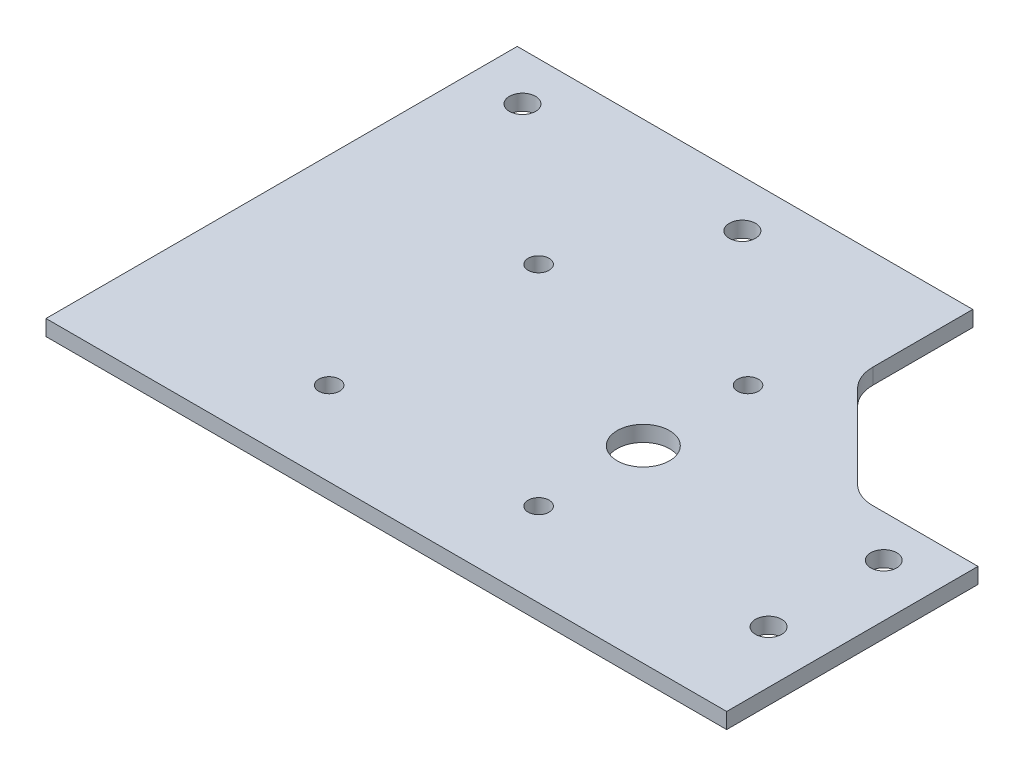
ISO-10303-21;
HEADER;
FILE_DESCRIPTION(('STEP AP214'),'2;1');
FILE_NAME('part.step','',(''),(''),'','','');
FILE_SCHEMA(('AUTOMOTIVE_DESIGN { 1 0 10303 214 1 1 1 1 }'));
ENDSEC;
DATA;
#1=APPLICATION_CONTEXT('core data for automotive mechanical design processes');
#2=APPLICATION_PROTOCOL_DEFINITION('international standard','automotive_design',2000,#1);
#3=PRODUCT_CONTEXT('',#1,'mechanical');
#4=PRODUCT('Part','Part','',(#3));
#5=PRODUCT_RELATED_PRODUCT_CATEGORY('part','',(#4));
#6=PRODUCT_DEFINITION_FORMATION('','',#4);
#7=PRODUCT_DEFINITION_CONTEXT('part definition',#1,'design');
#8=PRODUCT_DEFINITION('design','',#6,#7);
#9=PRODUCT_DEFINITION_SHAPE('','',#8);
#10=(LENGTH_UNIT() NAMED_UNIT(*) SI_UNIT(.MILLI.,.METRE.));
#11=(NAMED_UNIT(*) PLANE_ANGLE_UNIT() SI_UNIT($,.RADIAN.));
#12=(NAMED_UNIT(*) SI_UNIT($,.STERADIAN.) SOLID_ANGLE_UNIT());
#13=UNCERTAINTY_MEASURE_WITH_UNIT(LENGTH_MEASURE(1.E-05),#10,'distance_accuracy_value','');
#14=(GEOMETRIC_REPRESENTATION_CONTEXT(3) GLOBAL_UNCERTAINTY_ASSIGNED_CONTEXT((#13)) GLOBAL_UNIT_ASSIGNED_CONTEXT((#10,
#11,#12)) REPRESENTATION_CONTEXT('',''));
#15=CARTESIAN_POINT('',(0.,0.,0.));
#16=DIRECTION('',(0.,0.,1.));
#17=DIRECTION('',(1.,0.,0.));
#18=AXIS2_PLACEMENT_3D('',#15,#16,#17);
#19=CARTESIAN_POINT('',(-20.1005050633883,3.,34.9999999999999));
#20=DIRECTION('',(0.,1.,0.));
#21=DIRECTION('',(0.,0.,1.));
#22=AXIS2_PLACEMENT_3D('',#19,#20,#21);
#23=PLANE('',#22);
#24=CARTESIAN_POINT('',(-51.9195128742625,3.,34.));
#25=DIRECTION('',(0.,1.,0.));
#26=DIRECTION('',(0.,0.,1.));
#27=AXIS2_PLACEMENT_3D('',#24,#25,#26);
#28=CIRCLE('',#27,2.);
#29=CARTESIAN_POINT('',(-51.9195128742625,3.,36.));
#30=VERTEX_POINT('',#29);
#31=EDGE_CURVE('E240',#30,#30,#28,.T.);
#32=ORIENTED_EDGE('',*,*,#31,.F.);
#33=EDGE_LOOP('',(#32));
#34=FACE_BOUND('',#33,.T.);
#35=CARTESIAN_POINT('',(-91.9195128742625,3.,74.));
#36=DIRECTION('',(0.,1.,0.));
#37=DIRECTION('',(0.,0.,1.));
#38=AXIS2_PLACEMENT_3D('',#35,#36,#37);
#39=CIRCLE('',#38,2.);
#40=CARTESIAN_POINT('',(-91.9195128742625,3.,76.));
#41=VERTEX_POINT('',#40);
#42=EDGE_CURVE('E229',#41,#41,#39,.T.);
#43=ORIENTED_EDGE('',*,*,#42,.F.);
#44=EDGE_LOOP('',(#43));
#45=FACE_BOUND('',#44,.T.);
#46=CARTESIAN_POINT('',(-91.9195128742624,3.,34.));
#47=DIRECTION('',(0.,1.,0.));
#48=DIRECTION('',(0.,0.,1.));
#49=AXIS2_PLACEMENT_3D('',#46,#47,#48);
#50=CIRCLE('',#49,2.);
#51=CARTESIAN_POINT('',(-91.9195128742624,3.,36.));
#52=VERTEX_POINT('',#51);
#53=EDGE_CURVE('E228',#52,#52,#50,.T.);
#54=ORIENTED_EDGE('',*,*,#53,.F.);
#55=EDGE_LOOP('',(#54));
#56=FACE_BOUND('',#55,.T.);
#57=CARTESIAN_POINT('',(-51.9195128742625,3.,54.));
#58=DIRECTION('',(0.,1.,0.));
#59=DIRECTION('',(0.,0.,1.));
#60=AXIS2_PLACEMENT_3D('',#57,#58,#59);
#61=CIRCLE('',#60,4.99999999999999);
#62=CARTESIAN_POINT('',(-51.9195128742625,3.,59.));
#63=VERTEX_POINT('',#62);
#64=EDGE_CURVE('E222',#63,#63,#61,.T.);
#65=ORIENTED_EDGE('',*,*,#64,.F.);
#66=EDGE_LOOP('',(#65));
#67=FACE_BOUND('',#66,.T.);
#68=CARTESIAN_POINT('',(-51.9195128742625,3.,74.));
#69=DIRECTION('',(0.,1.,0.));
#70=DIRECTION('',(0.,0.,1.));
#71=AXIS2_PLACEMENT_3D('',#68,#69,#70);
#72=CIRCLE('',#71,2.);
#73=CARTESIAN_POINT('',(-51.9195128742625,3.,76.));
#74=VERTEX_POINT('',#73);
#75=EDGE_CURVE('E216',#74,#74,#72,.T.);
#76=ORIENTED_EDGE('',*,*,#75,.F.);
#77=EDGE_LOOP('',(#76));
#78=FACE_BOUND('',#77,.T.);
#79=CARTESIAN_POINT('',(-10.,3.,49.9999999999999));
#80=DIRECTION('',(0.,1.,0.));
#81=DIRECTION('',(0.,0.,1.));
#82=AXIS2_PLACEMENT_3D('',#79,#80,#81);
#83=CIRCLE('',#82,2.5);
#84=CARTESIAN_POINT('',(-10.,3.,52.4999999999999));
#85=VERTEX_POINT('',#84);
#86=EDGE_CURVE('E204',#85,#85,#83,.T.);
#87=ORIENTED_EDGE('',*,*,#86,.F.);
#88=EDGE_LOOP('',(#87));
#89=FACE_BOUND('',#88,.T.);
#90=CARTESIAN_POINT('',(-78.,3.,9.));
#91=DIRECTION('',(0.,1.,0.));
#92=DIRECTION('',(0.,0.,1.));
#93=AXIS2_PLACEMENT_3D('',#90,#91,#92);
#94=CIRCLE('',#93,2.5);
#95=CARTESIAN_POINT('',(-78.,3.,11.5));
#96=VERTEX_POINT('',#95);
#97=EDGE_CURVE('E140',#96,#96,#94,.T.);
#98=ORIENTED_EDGE('',*,*,#97,.F.);
#99=EDGE_LOOP('',(#98));
#100=FACE_BOUND('',#99,.T.);
#101=DIRECTION('',(0.,0.,-1.));
#102=VECTOR('',#101,1.);
#103=CARTESIAN_POINT('',(-43.,3.,19.1005050633882));
#104=LINE('',#103,#102);
#105=CARTESIAN_POINT('',(-43.,3.,19.1005050633883));
#106=VERTEX_POINT('',#105);
#107=CARTESIAN_POINT('',(-43.,3.,0.));
#108=VERTEX_POINT('',#107);
#109=EDGE_CURVE('E153',#106,#108,#104,.T.);
#110=ORIENTED_EDGE('',*,*,#109,.T.);
#111=DIRECTION('',(-1.,0.,0.));
#112=VECTOR('',#111,1.);
#113=CARTESIAN_POINT('',(-130.,3.,0.));
#114=LINE('',#113,#112);
#115=CARTESIAN_POINT('',(-130.,3.,0.));
#116=VERTEX_POINT('',#115);
#117=EDGE_CURVE('E96',#108,#116,#114,.T.);
#118=ORIENTED_EDGE('',*,*,#117,.T.);
#119=DIRECTION('',(0.,0.,1.));
#120=VECTOR('',#119,1.);
#121=CARTESIAN_POINT('',(-130.,3.,0.));
#122=LINE('',#121,#120);
#123=CARTESIAN_POINT('',(-130.,3.,90.));
#124=VERTEX_POINT('',#123);
#125=EDGE_CURVE('E171',#116,#124,#122,.T.);
#126=ORIENTED_EDGE('',*,*,#125,.T.);
#127=DIRECTION('',(1.,0.,0.));
#128=VECTOR('',#127,1.);
#129=CARTESIAN_POINT('',(-130.,3.,90.));
#130=LINE('',#129,#128);
#131=CARTESIAN_POINT('',(0.,3.,90.));
#132=VERTEX_POINT('',#131);
#133=EDGE_CURVE('E188',#124,#132,#130,.T.);
#134=ORIENTED_EDGE('',*,*,#133,.T.);
#135=DIRECTION('',(0.,0.,-1.));
#136=VECTOR('',#135,1.);
#137=CARTESIAN_POINT('',(0.,3.,41.9999999999999));
#138=LINE('',#137,#136);
#139=CARTESIAN_POINT('',(0.,3.,41.9999999999999));
#140=VERTEX_POINT('',#139);
#141=EDGE_CURVE('E187',#132,#140,#138,.T.);
#142=ORIENTED_EDGE('',*,*,#141,.T.);
#143=DIRECTION('',(-1.,0.,0.));
#144=VECTOR('',#143,1.);
#145=CARTESIAN_POINT('',(0.,3.,41.9999999999999));
#146=LINE('',#145,#144);
#147=CARTESIAN_POINT('',(-20.1005050633883,3.,41.9999999999999));
#148=VERTEX_POINT('',#147);
#149=EDGE_CURVE('E118',#140,#148,#146,.T.);
#150=ORIENTED_EDGE('',*,*,#149,.T.);
#151=CARTESIAN_POINT('',(-20.1005050633883,3.,34.9999999999999));
#152=DIRECTION('',(0.,-1.,0.));
#153=DIRECTION('',(0.,0.,1.));
#154=AXIS2_PLACEMENT_3D('',#151,#152,#153);
#155=CIRCLE('',#154,7.);
#156=CARTESIAN_POINT('',(-25.0502525316942,3.,39.9497474683058));
#157=VERTEX_POINT('',#156);
#158=EDGE_CURVE('E112',#148,#157,#155,.T.);
#159=ORIENTED_EDGE('',*,*,#158,.T.);
#160=DIRECTION('',(-0.707106781186548,0.,-0.707106781186547));
#161=VECTOR('',#160,1.);
#162=CARTESIAN_POINT('',(-40.9497474683058,3.,24.0502525316941));
#163=LINE('',#162,#161);
#164=CARTESIAN_POINT('',(-40.9497474683058,3.,24.0502525316941));
#165=VERTEX_POINT('',#164);
#166=EDGE_CURVE('E116',#157,#165,#163,.T.);
#167=ORIENTED_EDGE('',*,*,#166,.T.);
#168=CARTESIAN_POINT('',(-36.,3.,19.1005050633883));
#169=DIRECTION('',(0.,-1.,0.));
#170=DIRECTION('',(0.,0.,-1.));
#171=AXIS2_PLACEMENT_3D('',#168,#169,#170);
#172=CIRCLE('',#171,7.);
#173=EDGE_CURVE('E50',#165,#106,#172,.T.);
#174=ORIENTED_EDGE('',*,*,#173,.T.);
#175=EDGE_LOOP('',(#110,#118,#126,#134,#142,#150,#159,#167,#174));
#176=FACE_BOUND('',#175,.T.);
#177=CARTESIAN_POINT('',(-120.,3.,9.));
#178=DIRECTION('',(0.,1.,0.));
#179=DIRECTION('',(0.,0.,1.));
#180=AXIS2_PLACEMENT_3D('',#177,#178,#179);
#181=CIRCLE('',#180,2.50000000000001);
#182=CARTESIAN_POINT('',(-120.,3.,11.5));
#183=VERTEX_POINT('',#182);
#184=EDGE_CURVE('E198',#183,#183,#181,.T.);
#185=ORIENTED_EDGE('',*,*,#184,.F.);
#186=EDGE_LOOP('',(#185));
#187=FACE_BOUND('',#186,.T.);
#188=CARTESIAN_POINT('',(-10.,3.,71.9999999999999));
#189=DIRECTION('',(0.,1.,0.));
#190=DIRECTION('',(0.,0.,1.));
#191=AXIS2_PLACEMENT_3D('',#188,#189,#190);
#192=CIRCLE('',#191,2.50000000000002);
#193=CARTESIAN_POINT('',(-10.,3.,74.4999999999999));
#194=VERTEX_POINT('',#193);
#195=EDGE_CURVE('E210',#194,#194,#192,.T.);
#196=ORIENTED_EDGE('',*,*,#195,.F.);
#197=EDGE_LOOP('',(#196));
#198=FACE_BOUND('',#197,.T.);
#199=ADVANCED_FACE('F33',(#34,#45,#56,#67,#78,#89,#100,#176,#187,#198),#23,.T.);
#200=CARTESIAN_POINT('',(-20.1005050633883,0.,34.9999999999999));
#201=DIRECTION('',(0.,1.,0.));
#202=DIRECTION('',(0.,0.,1.));
#203=AXIS2_PLACEMENT_3D('',#200,#201,#202);
#204=PLANE('',#203);
#205=CARTESIAN_POINT('',(-51.9195128742625,0.,34.));
#206=DIRECTION('',(0.,1.,0.));
#207=DIRECTION('',(0.,0.,1.));
#208=AXIS2_PLACEMENT_3D('',#205,#206,#207);
#209=CIRCLE('',#208,2.);
#210=CARTESIAN_POINT('',(-51.9195128742625,0.,36.));
#211=VERTEX_POINT('',#210);
#212=EDGE_CURVE('E237',#211,#211,#209,.T.);
#213=ORIENTED_EDGE('',*,*,#212,.T.);
#214=EDGE_LOOP('',(#213));
#215=FACE_BOUND('',#214,.T.);
#216=CARTESIAN_POINT('',(-91.9195128742625,0.,74.));
#217=DIRECTION('',(0.,1.,0.));
#218=DIRECTION('',(0.,0.,1.));
#219=AXIS2_PLACEMENT_3D('',#216,#217,#218);
#220=CIRCLE('',#219,2.);
#221=CARTESIAN_POINT('',(-91.9195128742625,0.,76.));
#222=VERTEX_POINT('',#221);
#223=EDGE_CURVE('E243',#222,#222,#220,.T.);
#224=ORIENTED_EDGE('',*,*,#223,.T.);
#225=EDGE_LOOP('',(#224));
#226=FACE_BOUND('',#225,.T.);
#227=CARTESIAN_POINT('',(-91.9195128742624,0.,34.));
#228=DIRECTION('',(0.,1.,0.));
#229=DIRECTION('',(0.,0.,1.));
#230=AXIS2_PLACEMENT_3D('',#227,#228,#229);
#231=CIRCLE('',#230,2.);
#232=CARTESIAN_POINT('',(-91.9195128742624,0.,36.));
#233=VERTEX_POINT('',#232);
#234=EDGE_CURVE('E225',#233,#233,#231,.T.);
#235=ORIENTED_EDGE('',*,*,#234,.T.);
#236=EDGE_LOOP('',(#235));
#237=FACE_BOUND('',#236,.T.);
#238=CARTESIAN_POINT('',(-51.9195128742625,0.,54.));
#239=DIRECTION('',(0.,1.,0.));
#240=DIRECTION('',(0.,0.,1.));
#241=AXIS2_PLACEMENT_3D('',#238,#239,#240);
#242=CIRCLE('',#241,4.99999999999999);
#243=CARTESIAN_POINT('',(-51.9195128742625,0.,59.));
#244=VERTEX_POINT('',#243);
#245=EDGE_CURVE('E232',#244,#244,#242,.T.);
#246=ORIENTED_EDGE('',*,*,#245,.T.);
#247=EDGE_LOOP('',(#246));
#248=FACE_BOUND('',#247,.T.);
#249=CARTESIAN_POINT('',(-51.9195128742625,0.,74.));
#250=DIRECTION('',(0.,1.,0.));
#251=DIRECTION('',(0.,0.,1.));
#252=AXIS2_PLACEMENT_3D('',#249,#250,#251);
#253=CIRCLE('',#252,2.);
#254=CARTESIAN_POINT('',(-51.9195128742625,0.,76.));
#255=VERTEX_POINT('',#254);
#256=EDGE_CURVE('E219',#255,#255,#253,.T.);
#257=ORIENTED_EDGE('',*,*,#256,.T.);
#258=EDGE_LOOP('',(#257));
#259=FACE_BOUND('',#258,.T.);
#260=DIRECTION('',(0.,0.,-1.));
#261=VECTOR('',#260,1.);
#262=CARTESIAN_POINT('',(-43.,0.,19.1005050633882));
#263=LINE('',#262,#261);
#264=CARTESIAN_POINT('',(-43.,0.,19.1005050633883));
#265=VERTEX_POINT('',#264);
#266=CARTESIAN_POINT('',(-43.,0.,0.));
#267=VERTEX_POINT('',#266);
#268=EDGE_CURVE('E136',#265,#267,#263,.T.);
#269=ORIENTED_EDGE('',*,*,#268,.F.);
#270=CARTESIAN_POINT('',(-36.,0.,19.1005050633883));
#271=DIRECTION('',(0.,-1.,0.));
#272=DIRECTION('',(0.,0.,-1.));
#273=AXIS2_PLACEMENT_3D('',#270,#271,#272);
#274=CIRCLE('',#273,7.);
#275=CARTESIAN_POINT('',(-40.9497474683058,0.,24.0502525316941));
#276=VERTEX_POINT('',#275);
#277=EDGE_CURVE('E88',#276,#265,#274,.T.);
#278=ORIENTED_EDGE('',*,*,#277,.F.);
#279=DIRECTION('',(-0.707106781186548,0.,-0.707106781186547));
#280=VECTOR('',#279,1.);
#281=CARTESIAN_POINT('',(-40.9497474683058,0.,24.0502525316941));
#282=LINE('',#281,#280);
#283=CARTESIAN_POINT('',(-25.0502525316942,0.,39.9497474683058));
#284=VERTEX_POINT('',#283);
#285=EDGE_CURVE('E82',#284,#276,#282,.T.);
#286=ORIENTED_EDGE('',*,*,#285,.F.);
#287=CARTESIAN_POINT('',(-20.1005050633883,0.,34.9999999999999));
#288=DIRECTION('',(0.,-1.,0.));
#289=DIRECTION('',(0.,0.,1.));
#290=AXIS2_PLACEMENT_3D('',#287,#288,#289);
#291=CIRCLE('',#290,7.);
#292=CARTESIAN_POINT('',(-20.1005050633883,0.,41.9999999999999));
#293=VERTEX_POINT('',#292);
#294=EDGE_CURVE('E126',#293,#284,#291,.T.);
#295=ORIENTED_EDGE('',*,*,#294,.F.);
#296=DIRECTION('',(-1.,0.,0.));
#297=VECTOR('',#296,1.);
#298=CARTESIAN_POINT('',(0.,0.,41.9999999999999));
#299=LINE('',#298,#297);
#300=CARTESIAN_POINT('',(0.,0.,41.9999999999999));
#301=VERTEX_POINT('',#300);
#302=EDGE_CURVE('E148',#301,#293,#299,.T.);
#303=ORIENTED_EDGE('',*,*,#302,.F.);
#304=DIRECTION('',(0.,0.,-1.));
#305=VECTOR('',#304,1.);
#306=CARTESIAN_POINT('',(0.,0.,41.9999999999999));
#307=LINE('',#306,#305);
#308=CARTESIAN_POINT('',(0.,0.,90.));
#309=VERTEX_POINT('',#308);
#310=EDGE_CURVE('E146',#309,#301,#307,.T.);
#311=ORIENTED_EDGE('',*,*,#310,.F.);
#312=DIRECTION('',(1.,0.,0.));
#313=VECTOR('',#312,1.);
#314=CARTESIAN_POINT('',(-130.,0.,90.));
#315=LINE('',#314,#313);
#316=CARTESIAN_POINT('',(-130.,0.,90.));
#317=VERTEX_POINT('',#316);
#318=EDGE_CURVE('E144',#317,#309,#315,.T.);
#319=ORIENTED_EDGE('',*,*,#318,.F.);
#320=DIRECTION('',(0.,0.,1.));
#321=VECTOR('',#320,1.);
#322=CARTESIAN_POINT('',(-130.,0.,0.));
#323=LINE('',#322,#321);
#324=CARTESIAN_POINT('',(-130.,0.,0.));
#325=VERTEX_POINT('',#324);
#326=EDGE_CURVE('E142',#325,#317,#323,.T.);
#327=ORIENTED_EDGE('',*,*,#326,.F.);
#328=DIRECTION('',(-1.,0.,0.));
#329=VECTOR('',#328,1.);
#330=CARTESIAN_POINT('',(-130.,0.,0.));
#331=LINE('',#330,#329);
#332=EDGE_CURVE('E139',#267,#325,#331,.T.);
#333=ORIENTED_EDGE('',*,*,#332,.F.);
#334=EDGE_LOOP('',(#269,#278,#286,#295,#303,#311,#319,#327,#333));
#335=FACE_BOUND('',#334,.T.);
#336=CARTESIAN_POINT('',(-78.,0.,9.));
#337=DIRECTION('',(0.,1.,0.));
#338=DIRECTION('',(0.,0.,1.));
#339=AXIS2_PLACEMENT_3D('',#336,#337,#338);
#340=CIRCLE('',#339,2.5);
#341=CARTESIAN_POINT('',(-78.,0.,11.5));
#342=VERTEX_POINT('',#341);
#343=EDGE_CURVE('E195',#342,#342,#340,.T.);
#344=ORIENTED_EDGE('',*,*,#343,.T.);
#345=EDGE_LOOP('',(#344));
#346=FACE_BOUND('',#345,.T.);
#347=CARTESIAN_POINT('',(-120.,0.,9.));
#348=DIRECTION('',(0.,1.,0.));
#349=DIRECTION('',(0.,0.,1.));
#350=AXIS2_PLACEMENT_3D('',#347,#348,#349);
#351=CIRCLE('',#350,2.50000000000001);
#352=CARTESIAN_POINT('',(-120.,0.,11.5));
#353=VERTEX_POINT('',#352);
#354=EDGE_CURVE('E201',#353,#353,#351,.T.);
#355=ORIENTED_EDGE('',*,*,#354,.T.);
#356=EDGE_LOOP('',(#355));
#357=FACE_BOUND('',#356,.T.);
#358=CARTESIAN_POINT('',(-10.,0.,49.9999999999999));
#359=DIRECTION('',(0.,1.,0.));
#360=DIRECTION('',(0.,0.,1.));
#361=AXIS2_PLACEMENT_3D('',#358,#359,#360);
#362=CIRCLE('',#361,2.5);
#363=CARTESIAN_POINT('',(-10.,0.,52.4999999999999));
#364=VERTEX_POINT('',#363);
#365=EDGE_CURVE('E207',#364,#364,#362,.T.);
#366=ORIENTED_EDGE('',*,*,#365,.T.);
#367=EDGE_LOOP('',(#366));
#368=FACE_BOUND('',#367,.T.);
#369=CARTESIAN_POINT('',(-10.,0.,71.9999999999999));
#370=DIRECTION('',(0.,1.,0.));
#371=DIRECTION('',(0.,0.,1.));
#372=AXIS2_PLACEMENT_3D('',#369,#370,#371);
#373=CIRCLE('',#372,2.50000000000002);
#374=CARTESIAN_POINT('',(-10.,0.,74.4999999999999));
#375=VERTEX_POINT('',#374);
#376=EDGE_CURVE('E213',#375,#375,#373,.T.);
#377=ORIENTED_EDGE('',*,*,#376,.T.);
#378=EDGE_LOOP('',(#377));
#379=FACE_BOUND('',#378,.T.);
#380=ADVANCED_FACE('F175',(#215,#226,#237,#248,#259,#335,#346,#357,#368,#379),#204,.F.);
#381=CARTESIAN_POINT('',(-43.,3.,19.1005050633882));
#382=DIRECTION('',(-1.,0.,0.));
#383=DIRECTION('',(0.,0.,1.));
#384=AXIS2_PLACEMENT_3D('',#381,#382,#383);
#385=PLANE('',#384);
#386=ORIENTED_EDGE('',*,*,#268,.T.);
#387=DIRECTION('',(0.,-1.,0.));
#388=VECTOR('',#387,1.);
#389=CARTESIAN_POINT('',(-43.,3.,0.));
#390=LINE('',#389,#388);
#391=EDGE_CURVE('E11',#108,#267,#390,.T.);
#392=ORIENTED_EDGE('',*,*,#391,.F.);
#393=ORIENTED_EDGE('',*,*,#109,.F.);
#394=DIRECTION('',(0.,-1.,0.));
#395=VECTOR('',#394,1.);
#396=CARTESIAN_POINT('',(-43.,3.,19.1005050633883));
#397=LINE('',#396,#395);
#398=EDGE_CURVE('E132',#106,#265,#397,.T.);
#399=ORIENTED_EDGE('',*,*,#398,.T.);
#400=EDGE_LOOP('',(#386,#392,#393,#399));
#401=FACE_BOUND('',#400,.T.);
#402=ADVANCED_FACE('F35',(#401),#385,.F.);
#403=CARTESIAN_POINT('',(-130.,3.,0.));
#404=DIRECTION('',(0.,0.,1.));
#405=DIRECTION('',(1.,0.,0.));
#406=AXIS2_PLACEMENT_3D('',#403,#404,#405);
#407=PLANE('',#406);
#408=ORIENTED_EDGE('',*,*,#332,.T.);
#409=DIRECTION('',(0.,-1.,0.));
#410=VECTOR('',#409,1.);
#411=CARTESIAN_POINT('',(-130.,3.,0.));
#412=LINE('',#411,#410);
#413=EDGE_CURVE('E42',#116,#325,#412,.T.);
#414=ORIENTED_EDGE('',*,*,#413,.F.);
#415=ORIENTED_EDGE('',*,*,#117,.F.);
#416=ORIENTED_EDGE('',*,*,#391,.T.);
#417=EDGE_LOOP('',(#408,#414,#415,#416));
#418=FACE_BOUND('',#417,.T.);
#419=ADVANCED_FACE('F318',(#418),#407,.F.);
#420=CARTESIAN_POINT('',(-130.,3.,0.));
#421=DIRECTION('',(1.,0.,0.));
#422=DIRECTION('',(0.,0.,-1.));
#423=AXIS2_PLACEMENT_3D('',#420,#421,#422);
#424=PLANE('',#423);
#425=ORIENTED_EDGE('',*,*,#326,.T.);
#426=DIRECTION('',(0.,-1.,0.));
#427=VECTOR('',#426,1.);
#428=CARTESIAN_POINT('',(-130.,3.,90.));
#429=LINE('',#428,#427);
#430=EDGE_CURVE('E163',#124,#317,#429,.T.);
#431=ORIENTED_EDGE('',*,*,#430,.F.);
#432=ORIENTED_EDGE('',*,*,#125,.F.);
#433=ORIENTED_EDGE('',*,*,#413,.T.);
#434=EDGE_LOOP('',(#425,#431,#432,#433));
#435=FACE_BOUND('',#434,.T.);
#436=ADVANCED_FACE('F169',(#435),#424,.F.);
#437=CARTESIAN_POINT('',(-130.,3.,90.));
#438=DIRECTION('',(0.,0.,-1.));
#439=DIRECTION('',(-1.,0.,0.));
#440=AXIS2_PLACEMENT_3D('',#437,#438,#439);
#441=PLANE('',#440);
#442=ORIENTED_EDGE('',*,*,#318,.T.);
#443=DIRECTION('',(0.,-1.,0.));
#444=VECTOR('',#443,1.);
#445=CARTESIAN_POINT('',(0.,3.,90.));
#446=LINE('',#445,#444);
#447=EDGE_CURVE('E160',#132,#309,#446,.T.);
#448=ORIENTED_EDGE('',*,*,#447,.F.);
#449=ORIENTED_EDGE('',*,*,#133,.F.);
#450=ORIENTED_EDGE('',*,*,#430,.T.);
#451=EDGE_LOOP('',(#442,#448,#449,#450));
#452=FACE_BOUND('',#451,.T.);
#453=ADVANCED_FACE('F181',(#452),#441,.F.);
#454=CARTESIAN_POINT('',(0.,3.,41.9999999999999));
#455=DIRECTION('',(-1.,0.,0.));
#456=DIRECTION('',(0.,0.,1.));
#457=AXIS2_PLACEMENT_3D('',#454,#455,#456);
#458=PLANE('',#457);
#459=ORIENTED_EDGE('',*,*,#310,.T.);
#460=DIRECTION('',(0.,-1.,0.));
#461=VECTOR('',#460,1.);
#462=CARTESIAN_POINT('',(0.,3.,41.9999999999999));
#463=LINE('',#462,#461);
#464=EDGE_CURVE('E157',#140,#301,#463,.T.);
#465=ORIENTED_EDGE('',*,*,#464,.F.);
#466=ORIENTED_EDGE('',*,*,#141,.F.);
#467=ORIENTED_EDGE('',*,*,#447,.T.);
#468=EDGE_LOOP('',(#459,#465,#466,#467));
#469=FACE_BOUND('',#468,.T.);
#470=ADVANCED_FACE('F185',(#469),#458,.F.);
#471=CARTESIAN_POINT('',(0.,3.,41.9999999999999));
#472=DIRECTION('',(0.,0.,1.));
#473=DIRECTION('',(1.,0.,0.));
#474=AXIS2_PLACEMENT_3D('',#471,#472,#473);
#475=PLANE('',#474);
#476=ORIENTED_EDGE('',*,*,#302,.T.);
#477=DIRECTION('',(0.,-1.,0.));
#478=VECTOR('',#477,1.);
#479=CARTESIAN_POINT('',(-20.1005050633883,3.,41.9999999999999));
#480=LINE('',#479,#478);
#481=EDGE_CURVE('E127',#148,#293,#480,.T.);
#482=ORIENTED_EDGE('',*,*,#481,.F.);
#483=ORIENTED_EDGE('',*,*,#149,.F.);
#484=ORIENTED_EDGE('',*,*,#464,.T.);
#485=EDGE_LOOP('',(#476,#482,#483,#484));
#486=FACE_BOUND('',#485,.T.);
#487=ADVANCED_FACE('F309',(#486),#475,.F.);
#488=CARTESIAN_POINT('',(-20.1005050633883,3.,34.9999999999999));
#489=DIRECTION('',(0.,-1.,0.));
#490=DIRECTION('',(0.,0.,-1.));
#491=AXIS2_PLACEMENT_3D('',#488,#489,#490);
#492=CYLINDRICAL_SURFACE('',#491,7.);
#493=ORIENTED_EDGE('',*,*,#294,.T.);
#494=DIRECTION('',(0.,-1.,0.));
#495=VECTOR('',#494,1.);
#496=CARTESIAN_POINT('',(-25.0502525316942,3.,39.9497474683058));
#497=LINE('',#496,#495);
#498=EDGE_CURVE('E123',#157,#284,#497,.T.);
#499=ORIENTED_EDGE('',*,*,#498,.F.);
#500=ORIENTED_EDGE('',*,*,#158,.F.);
#501=ORIENTED_EDGE('',*,*,#481,.T.);
#502=EDGE_LOOP('',(#493,#499,#500,#501));
#503=FACE_BOUND('',#502,.T.);
#504=ADVANCED_FACE('F124',(#503),#492,.F.);
#505=CARTESIAN_POINT('',(-40.9497474683058,3.,24.0502525316941));
#506=DIRECTION('',(-0.707106781186547,0.,0.707106781186548));
#507=DIRECTION('',(0.707106781186548,0.,0.707106781186547));
#508=AXIS2_PLACEMENT_3D('',#505,#506,#507);
#509=PLANE('',#508);
#510=ORIENTED_EDGE('',*,*,#285,.T.);
#511=DIRECTION('',(0.,-1.,0.));
#512=VECTOR('',#511,1.);
#513=CARTESIAN_POINT('',(-40.9497474683058,3.,24.0502525316941));
#514=LINE('',#513,#512);
#515=EDGE_CURVE('E128',#165,#276,#514,.T.);
#516=ORIENTED_EDGE('',*,*,#515,.F.);
#517=ORIENTED_EDGE('',*,*,#166,.F.);
#518=ORIENTED_EDGE('',*,*,#498,.T.);
#519=EDGE_LOOP('',(#510,#516,#517,#518));
#520=FACE_BOUND('',#519,.T.);
#521=ADVANCED_FACE('F130',(#520),#509,.F.);
#522=CARTESIAN_POINT('',(-36.,3.,19.1005050633883));
#523=DIRECTION('',(0.,-1.,0.));
#524=DIRECTION('',(0.,0.,-1.));
#525=AXIS2_PLACEMENT_3D('',#522,#523,#524);
#526=CYLINDRICAL_SURFACE('',#525,7.);
#527=ORIENTED_EDGE('',*,*,#277,.T.);
#528=ORIENTED_EDGE('',*,*,#398,.F.);
#529=ORIENTED_EDGE('',*,*,#173,.F.);
#530=ORIENTED_EDGE('',*,*,#515,.T.);
#531=EDGE_LOOP('',(#527,#528,#529,#530));
#532=FACE_BOUND('',#531,.T.);
#533=ADVANCED_FACE('F270',(#532),#526,.F.);
#534=CARTESIAN_POINT('',(-78.,3.,9.));
#535=DIRECTION('',(0.,-1.,0.));
#536=DIRECTION('',(0.,0.,-1.));
#537=AXIS2_PLACEMENT_3D('',#534,#535,#536);
#538=CYLINDRICAL_SURFACE('',#537,2.5);
#539=ORIENTED_EDGE('',*,*,#97,.T.);
#540=EDGE_LOOP('',(#539));
#541=FACE_BOUND('',#540,.T.);
#542=ORIENTED_EDGE('',*,*,#343,.F.);
#543=EDGE_LOOP('',(#542));
#544=FACE_BOUND('',#543,.T.);
#545=ADVANCED_FACE('F266',(#541,#544),#538,.F.);
#546=CARTESIAN_POINT('',(-120.,3.,9.));
#547=DIRECTION('',(0.,-1.,0.));
#548=DIRECTION('',(0.,0.,-1.));
#549=AXIS2_PLACEMENT_3D('',#546,#547,#548);
#550=CYLINDRICAL_SURFACE('',#549,2.50000000000001);
#551=ORIENTED_EDGE('',*,*,#184,.T.);
#552=EDGE_LOOP('',(#551));
#553=FACE_BOUND('',#552,.T.);
#554=ORIENTED_EDGE('',*,*,#354,.F.);
#555=EDGE_LOOP('',(#554));
#556=FACE_BOUND('',#555,.T.);
#557=ADVANCED_FACE('F269',(#553,#556),#550,.F.);
#558=CARTESIAN_POINT('',(-10.,3.,49.9999999999999));
#559=DIRECTION('',(0.,-1.,0.));
#560=DIRECTION('',(0.,0.,-1.));
#561=AXIS2_PLACEMENT_3D('',#558,#559,#560);
#562=CYLINDRICAL_SURFACE('',#561,2.5);
#563=ORIENTED_EDGE('',*,*,#86,.T.);
#564=EDGE_LOOP('',(#563));
#565=FACE_BOUND('',#564,.T.);
#566=ORIENTED_EDGE('',*,*,#365,.F.);
#567=EDGE_LOOP('',(#566));
#568=FACE_BOUND('',#567,.T.);
#569=ADVANCED_FACE('F286',(#565,#568),#562,.F.);
#570=CARTESIAN_POINT('',(-10.,3.,71.9999999999999));
#571=DIRECTION('',(0.,-1.,0.));
#572=DIRECTION('',(0.,0.,-1.));
#573=AXIS2_PLACEMENT_3D('',#570,#571,#572);
#574=CYLINDRICAL_SURFACE('',#573,2.50000000000002);
#575=ORIENTED_EDGE('',*,*,#195,.T.);
#576=EDGE_LOOP('',(#575));
#577=FACE_BOUND('',#576,.T.);
#578=ORIENTED_EDGE('',*,*,#376,.F.);
#579=EDGE_LOOP('',(#578));
#580=FACE_BOUND('',#579,.T.);
#581=ADVANCED_FACE('F283',(#577,#580),#574,.F.);
#582=CARTESIAN_POINT('',(-51.9195128742625,3.,74.));
#583=DIRECTION('',(0.,-1.,0.));
#584=DIRECTION('',(0.,0.,-1.));
#585=AXIS2_PLACEMENT_3D('',#582,#583,#584);
#586=CYLINDRICAL_SURFACE('',#585,2.);
#587=ORIENTED_EDGE('',*,*,#75,.T.);
#588=EDGE_LOOP('',(#587));
#589=FACE_BOUND('',#588,.T.);
#590=ORIENTED_EDGE('',*,*,#256,.F.);
#591=EDGE_LOOP('',(#590));
#592=FACE_BOUND('',#591,.T.);
#593=ADVANCED_FACE('F285',(#589,#592),#586,.F.);
#594=CARTESIAN_POINT('',(-51.9195128742625,3.,54.));
#595=DIRECTION('',(0.,-1.,0.));
#596=DIRECTION('',(0.,0.,-1.));
#597=AXIS2_PLACEMENT_3D('',#594,#595,#596);
#598=CYLINDRICAL_SURFACE('',#597,4.99999999999999);
#599=ORIENTED_EDGE('',*,*,#64,.T.);
#600=EDGE_LOOP('',(#599));
#601=FACE_BOUND('',#600,.T.);
#602=ORIENTED_EDGE('',*,*,#245,.F.);
#603=EDGE_LOOP('',(#602));
#604=FACE_BOUND('',#603,.T.);
#605=ADVANCED_FACE('F293',(#601,#604),#598,.F.);
#606=CARTESIAN_POINT('',(-91.9195128742624,3.,34.));
#607=DIRECTION('',(0.,-1.,0.));
#608=DIRECTION('',(0.,0.,-1.));
#609=AXIS2_PLACEMENT_3D('',#606,#607,#608);
#610=CYLINDRICAL_SURFACE('',#609,2.);
#611=ORIENTED_EDGE('',*,*,#53,.T.);
#612=EDGE_LOOP('',(#611));
#613=FACE_BOUND('',#612,.T.);
#614=ORIENTED_EDGE('',*,*,#234,.F.);
#615=EDGE_LOOP('',(#614));
#616=FACE_BOUND('',#615,.T.);
#617=ADVANCED_FACE('F423',(#613,#616),#610,.F.);
#618=CARTESIAN_POINT('',(-91.9195128742625,3.,74.));
#619=DIRECTION('',(0.,-1.,0.));
#620=DIRECTION('',(0.,0.,-1.));
#621=AXIS2_PLACEMENT_3D('',#618,#619,#620);
#622=CYLINDRICAL_SURFACE('',#621,2.);
#623=ORIENTED_EDGE('',*,*,#42,.T.);
#624=EDGE_LOOP('',(#623));
#625=FACE_BOUND('',#624,.T.);
#626=ORIENTED_EDGE('',*,*,#223,.F.);
#627=EDGE_LOOP('',(#626));
#628=FACE_BOUND('',#627,.T.);
#629=ADVANCED_FACE('F249',(#625,#628),#622,.F.);
#630=CARTESIAN_POINT('',(-51.9195128742625,3.,34.));
#631=DIRECTION('',(0.,-1.,0.));
#632=DIRECTION('',(0.,0.,-1.));
#633=AXIS2_PLACEMENT_3D('',#630,#631,#632);
#634=CYLINDRICAL_SURFACE('',#633,2.);
#635=ORIENTED_EDGE('',*,*,#31,.T.);
#636=EDGE_LOOP('',(#635));
#637=FACE_BOUND('',#636,.T.);
#638=ORIENTED_EDGE('',*,*,#212,.F.);
#639=EDGE_LOOP('',(#638));
#640=FACE_BOUND('',#639,.T.);
#641=ADVANCED_FACE('F439',(#637,#640),#634,.F.);
#642=CLOSED_SHELL('',(#199,#380,#402,#419,#436,#453,#470,#487,#504,#521,#533,#545,#557,#569,
#581,#593,#605,#617,#629,#641));
#643=MANIFOLD_SOLID_BREP('B2',#642);
#644=ADVANCED_BREP_SHAPE_REPRESENTATION('',(#18,#643),#14);
#645=SHAPE_DEFINITION_REPRESENTATION(#9,#644);
ENDSEC;
END-ISO-10303-21;
